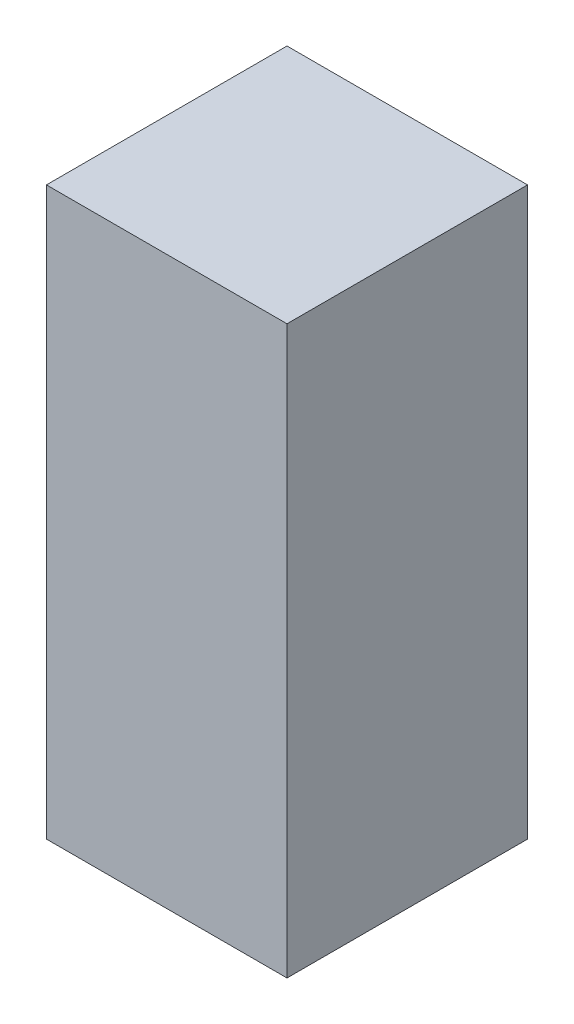
ISO-10303-21;
HEADER;
FILE_DESCRIPTION(('STEP AP214'),'2;1');
FILE_NAME('part.step','',(''),(''),'','','');
FILE_SCHEMA(('AUTOMOTIVE_DESIGN { 1 0 10303 214 1 1 1 1 }'));
ENDSEC;
DATA;
#1=APPLICATION_CONTEXT('core data for automotive mechanical design processes');
#2=APPLICATION_PROTOCOL_DEFINITION('international standard','automotive_design',2000,#1);
#3=PRODUCT_CONTEXT('',#1,'mechanical');
#4=PRODUCT('Part','Part','',(#3));
#5=PRODUCT_RELATED_PRODUCT_CATEGORY('part','',(#4));
#6=PRODUCT_DEFINITION_FORMATION('','',#4);
#7=PRODUCT_DEFINITION_CONTEXT('part definition',#1,'design');
#8=PRODUCT_DEFINITION('design','',#6,#7);
#9=PRODUCT_DEFINITION_SHAPE('','',#8);
#10=(LENGTH_UNIT() NAMED_UNIT(*) SI_UNIT(.MILLI.,.METRE.));
#11=(NAMED_UNIT(*) PLANE_ANGLE_UNIT() SI_UNIT($,.RADIAN.));
#12=(NAMED_UNIT(*) SI_UNIT($,.STERADIAN.) SOLID_ANGLE_UNIT());
#13=UNCERTAINTY_MEASURE_WITH_UNIT(LENGTH_MEASURE(1.E-05),#10,'distance_accuracy_value','');
#14=(GEOMETRIC_REPRESENTATION_CONTEXT(3) GLOBAL_UNCERTAINTY_ASSIGNED_CONTEXT((#13)) GLOBAL_UNIT_ASSIGNED_CONTEXT((#10,
#11,#12)) REPRESENTATION_CONTEXT('',''));
#15=CARTESIAN_POINT('',(0.,0.,0.));
#16=DIRECTION('',(0.,0.,1.));
#17=DIRECTION('',(1.,0.,0.));
#18=AXIS2_PLACEMENT_3D('',#15,#16,#17);
#19=CARTESIAN_POINT('',(9.15,21.55,-18.3));
#20=DIRECTION('',(1.,0.,0.));
#21=DIRECTION('',(0.,1.,0.));
#22=AXIS2_PLACEMENT_3D('',#19,#20,#21);
#23=PLANE('',#22);
#24=DIRECTION('',(0.,1.,0.));
#25=VECTOR('',#24,1.);
#26=CARTESIAN_POINT('',(9.15,21.55,0.));
#27=LINE('',#26,#25);
#28=CARTESIAN_POINT('',(9.15000000000001,-21.55,0.));
#29=VERTEX_POINT('',#28);
#30=CARTESIAN_POINT('',(9.15,21.55,0.));
#31=VERTEX_POINT('',#30);
#32=EDGE_CURVE('E97',#29,#31,#27,.T.);
#33=ORIENTED_EDGE('',*,*,#32,.F.);
#34=DIRECTION('',(0.,0.,1.));
#35=VECTOR('',#34,1.);
#36=CARTESIAN_POINT('',(9.15000000000001,-21.55,-18.3));
#37=LINE('',#36,#35);
#38=CARTESIAN_POINT('',(9.15000000000001,-21.55,-18.3));
#39=VERTEX_POINT('',#38);
#40=EDGE_CURVE('E11',#39,#29,#37,.T.);
#41=ORIENTED_EDGE('',*,*,#40,.F.);
#42=DIRECTION('',(0.,1.,0.));
#43=VECTOR('',#42,1.);
#44=CARTESIAN_POINT('',(9.15,21.55,-18.3));
#45=LINE('',#44,#43);
#46=CARTESIAN_POINT('',(9.15,21.55,-18.3));
#47=VERTEX_POINT('',#46);
#48=EDGE_CURVE('E91',#39,#47,#45,.T.);
#49=ORIENTED_EDGE('',*,*,#48,.T.);
#50=DIRECTION('',(0.,0.,1.));
#51=VECTOR('',#50,1.);
#52=CARTESIAN_POINT('',(9.15,21.55,-18.3));
#53=LINE('',#52,#51);
#54=EDGE_CURVE('E36',#47,#31,#53,.T.);
#55=ORIENTED_EDGE('',*,*,#54,.T.);
#56=EDGE_LOOP('',(#33,#41,#49,#55));
#57=FACE_BOUND('',#56,.T.);
#58=ADVANCED_FACE('F33',(#57),#23,.T.);
#59=CARTESIAN_POINT('',(-9.15,-21.55,-18.3));
#60=DIRECTION('',(0.,-1.,0.));
#61=DIRECTION('',(0.,0.,-1.));
#62=AXIS2_PLACEMENT_3D('',#59,#60,#61);
#63=PLANE('',#62);
#64=DIRECTION('',(1.,0.,0.));
#65=VECTOR('',#64,1.);
#66=CARTESIAN_POINT('',(-9.15,-21.55,0.));
#67=LINE('',#66,#65);
#68=CARTESIAN_POINT('',(-9.15,-21.55,0.));
#69=VERTEX_POINT('',#68);
#70=EDGE_CURVE('E93',#69,#29,#67,.T.);
#71=ORIENTED_EDGE('',*,*,#70,.F.);
#72=DIRECTION('',(0.,0.,1.));
#73=VECTOR('',#72,1.);
#74=CARTESIAN_POINT('',(-9.15,-21.55,-18.3));
#75=LINE('',#74,#73);
#76=CARTESIAN_POINT('',(-9.15,-21.55,-18.3));
#77=VERTEX_POINT('',#76);
#78=EDGE_CURVE('E42',#77,#69,#75,.T.);
#79=ORIENTED_EDGE('',*,*,#78,.F.);
#80=DIRECTION('',(1.,0.,0.));
#81=VECTOR('',#80,1.);
#82=CARTESIAN_POINT('',(-9.15,-21.55,-18.3));
#83=LINE('',#82,#81);
#84=EDGE_CURVE('E88',#77,#39,#83,.T.);
#85=ORIENTED_EDGE('',*,*,#84,.T.);
#86=ORIENTED_EDGE('',*,*,#40,.T.);
#87=EDGE_LOOP('',(#71,#79,#85,#86));
#88=FACE_BOUND('',#87,.T.);
#89=ADVANCED_FACE('F107',(#88),#63,.T.);
#90=CARTESIAN_POINT('',(-9.15,21.55,-18.3));
#91=DIRECTION('',(-1.,0.,0.));
#92=DIRECTION('',(0.,-1.,0.));
#93=AXIS2_PLACEMENT_3D('',#90,#91,#92);
#94=PLANE('',#93);
#95=DIRECTION('',(0.,-1.,0.));
#96=VECTOR('',#95,1.);
#97=CARTESIAN_POINT('',(-9.15,21.55,0.));
#98=LINE('',#97,#96);
#99=CARTESIAN_POINT('',(-9.15,21.55,0.));
#100=VERTEX_POINT('',#99);
#101=EDGE_CURVE('E83',#100,#69,#98,.T.);
#102=ORIENTED_EDGE('',*,*,#101,.F.);
#103=DIRECTION('',(0.,0.,1.));
#104=VECTOR('',#103,1.);
#105=CARTESIAN_POINT('',(-9.15,21.55,-18.3));
#106=LINE('',#105,#104);
#107=CARTESIAN_POINT('',(-9.15,21.55,-18.3));
#108=VERTEX_POINT('',#107);
#109=EDGE_CURVE('E78',#108,#100,#106,.T.);
#110=ORIENTED_EDGE('',*,*,#109,.F.);
#111=DIRECTION('',(0.,-1.,0.));
#112=VECTOR('',#111,1.);
#113=CARTESIAN_POINT('',(-9.15,21.55,-18.3));
#114=LINE('',#113,#112);
#115=EDGE_CURVE('E81',#108,#77,#114,.T.);
#116=ORIENTED_EDGE('',*,*,#115,.T.);
#117=ORIENTED_EDGE('',*,*,#78,.T.);
#118=EDGE_LOOP('',(#102,#110,#116,#117));
#119=FACE_BOUND('',#118,.T.);
#120=ADVANCED_FACE('F80',(#119),#94,.T.);
#121=CARTESIAN_POINT('',(-9.15,21.55,-18.3));
#122=DIRECTION('',(0.,1.,0.));
#123=DIRECTION('',(0.,0.,1.));
#124=AXIS2_PLACEMENT_3D('',#121,#122,#123);
#125=PLANE('',#124);
#126=DIRECTION('',(-1.,0.,0.));
#127=VECTOR('',#126,1.);
#128=CARTESIAN_POINT('',(-9.15,21.55,0.));
#129=LINE('',#128,#127);
#130=EDGE_CURVE('E100',#31,#100,#129,.T.);
#131=ORIENTED_EDGE('',*,*,#130,.F.);
#132=ORIENTED_EDGE('',*,*,#54,.F.);
#133=DIRECTION('',(-1.,0.,0.));
#134=VECTOR('',#133,1.);
#135=CARTESIAN_POINT('',(-9.15,21.55,-18.3));
#136=LINE('',#135,#134);
#137=EDGE_CURVE('E87',#47,#108,#136,.T.);
#138=ORIENTED_EDGE('',*,*,#137,.T.);
#139=ORIENTED_EDGE('',*,*,#109,.T.);
#140=EDGE_LOOP('',(#131,#132,#138,#139));
#141=FACE_BOUND('',#140,.T.);
#142=ADVANCED_FACE('F90',(#141),#125,.T.);
#143=CARTESIAN_POINT('',(0.,0.,-18.3));
#144=DIRECTION('',(0.,0.,1.));
#145=DIRECTION('',(1.,0.,0.));
#146=AXIS2_PLACEMENT_3D('',#143,#144,#145);
#147=PLANE('',#146);
#148=ORIENTED_EDGE('',*,*,#48,.F.);
#149=ORIENTED_EDGE('',*,*,#84,.F.);
#150=ORIENTED_EDGE('',*,*,#115,.F.);
#151=ORIENTED_EDGE('',*,*,#137,.F.);
#152=EDGE_LOOP('',(#148,#149,#150,#151));
#153=FACE_BOUND('',#152,.T.);
#154=ADVANCED_FACE('F86',(#153),#147,.F.);
#155=CARTESIAN_POINT('',(0.,0.,0.));
#156=DIRECTION('',(0.,0.,1.));
#157=DIRECTION('',(1.,0.,0.));
#158=AXIS2_PLACEMENT_3D('',#155,#156,#157);
#159=PLANE('',#158);
#160=ORIENTED_EDGE('',*,*,#32,.T.);
#161=ORIENTED_EDGE('',*,*,#130,.T.);
#162=ORIENTED_EDGE('',*,*,#101,.T.);
#163=ORIENTED_EDGE('',*,*,#70,.T.);
#164=EDGE_LOOP('',(#160,#161,#162,#163));
#165=FACE_BOUND('',#164,.T.);
#166=ADVANCED_FACE('F106',(#165),#159,.T.);
#167=CLOSED_SHELL('',(#58,#89,#120,#142,#154,#166));
#168=MANIFOLD_SOLID_BREP('B2',#167);
#169=ADVANCED_BREP_SHAPE_REPRESENTATION('',(#18,#168),#14);
#170=SHAPE_DEFINITION_REPRESENTATION(#9,#169);
ENDSEC;
END-ISO-10303-21;
